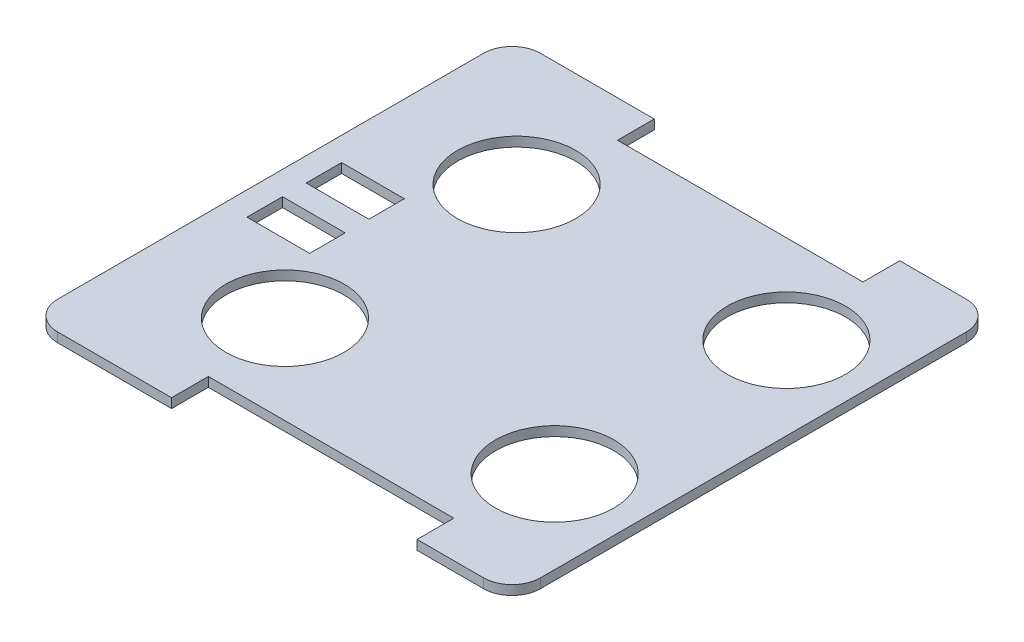
ISO-10303-21;
HEADER;
FILE_DESCRIPTION(('STEP AP214'),'2;1');
FILE_NAME('part.step','',(''),(''),'','','');
FILE_SCHEMA(('AUTOMOTIVE_DESIGN { 1 0 10303 214 1 1 1 1 }'));
ENDSEC;
DATA;
#1=APPLICATION_CONTEXT('core data for automotive mechanical design processes');
#2=APPLICATION_PROTOCOL_DEFINITION('international standard','automotive_design',2000,#1);
#3=PRODUCT_CONTEXT('',#1,'mechanical');
#4=PRODUCT('Part','Part','',(#3));
#5=PRODUCT_RELATED_PRODUCT_CATEGORY('part','',(#4));
#6=PRODUCT_DEFINITION_FORMATION('','',#4);
#7=PRODUCT_DEFINITION_CONTEXT('part definition',#1,'design');
#8=PRODUCT_DEFINITION('design','',#6,#7);
#9=PRODUCT_DEFINITION_SHAPE('','',#8);
#10=(LENGTH_UNIT() NAMED_UNIT(*) SI_UNIT(.MILLI.,.METRE.));
#11=(NAMED_UNIT(*) PLANE_ANGLE_UNIT() SI_UNIT($,.RADIAN.));
#12=(NAMED_UNIT(*) SI_UNIT($,.STERADIAN.) SOLID_ANGLE_UNIT());
#13=UNCERTAINTY_MEASURE_WITH_UNIT(LENGTH_MEASURE(1.E-05),#10,'distance_accuracy_value','');
#14=(GEOMETRIC_REPRESENTATION_CONTEXT(3) GLOBAL_UNCERTAINTY_ASSIGNED_CONTEXT((#13)) GLOBAL_UNIT_ASSIGNED_CONTEXT((#10,
#11,#12)) REPRESENTATION_CONTEXT('',''));
#15=CARTESIAN_POINT('',(0.,0.,0.));
#16=DIRECTION('',(0.,0.,1.));
#17=DIRECTION('',(1.,0.,0.));
#18=AXIS2_PLACEMENT_3D('',#15,#16,#17);
#19=CARTESIAN_POINT('',(-135.857036721238,58.7071385573017,92.1));
#20=DIRECTION('',(-1.,0.,0.));
#21=DIRECTION('',(0.,0.,1.));
#22=AXIS2_PLACEMENT_3D('',#19,#20,#21);
#23=PLANE('',#22);
#24=DIRECTION('',(0.,0.,-1.));
#25=VECTOR('',#24,1.);
#26=CARTESIAN_POINT('',(-135.857036721238,50.7071385573017,92.1));
#27=LINE('',#26,#25);
#28=CARTESIAN_POINT('',(-135.857036721238,50.7071385573017,92.1));
#29=VERTEX_POINT('',#28);
#30=CARTESIAN_POINT('',(-135.857036721238,50.7071385573017,61.0044654302729));
#31=VERTEX_POINT('',#30);
#32=EDGE_CURVE('E280',#29,#31,#27,.T.);
#33=ORIENTED_EDGE('',*,*,#32,.T.);
#34=DIRECTION('',(0.,-1.,0.));
#35=VECTOR('',#34,1.);
#36=CARTESIAN_POINT('',(-135.857036721238,58.7071385573017,61.0044654302729));
#37=LINE('',#36,#35);
#38=CARTESIAN_POINT('',(-135.857036721238,58.7071385573017,61.0044654302729));
#39=VERTEX_POINT('',#38);
#40=EDGE_CURVE('E11',#39,#31,#37,.T.);
#41=ORIENTED_EDGE('',*,*,#40,.F.);
#42=DIRECTION('',(0.,0.,-1.));
#43=VECTOR('',#42,1.);
#44=CARTESIAN_POINT('',(-135.857036721238,58.7071385573017,92.1));
#45=LINE('',#44,#43);
#46=CARTESIAN_POINT('',(-135.857036721238,58.7071385573017,92.1));
#47=VERTEX_POINT('',#46);
#48=EDGE_CURVE('E281',#47,#39,#45,.T.);
#49=ORIENTED_EDGE('',*,*,#48,.F.);
#50=DIRECTION('',(0.,-1.,0.));
#51=VECTOR('',#50,1.);
#52=CARTESIAN_POINT('',(-135.857036721238,58.7071385573017,92.1));
#53=LINE('',#52,#51);
#54=EDGE_CURVE('E315',#47,#29,#53,.T.);
#55=ORIENTED_EDGE('',*,*,#54,.T.);
#56=EDGE_LOOP('',(#33,#41,#49,#55));
#57=FACE_BOUND('',#56,.T.);
#58=ADVANCED_FACE('F41',(#57),#23,.F.);
#59=CARTESIAN_POINT('',(-232.102036721238,58.7071385573017,61.0044654302729));
#60=DIRECTION('',(0.,0.,1.));
#61=DIRECTION('',(1.,0.,0.));
#62=AXIS2_PLACEMENT_3D('',#59,#60,#61);
#63=PLANE('',#62);
#64=DIRECTION('',(-1.,0.,0.));
#65=VECTOR('',#64,1.);
#66=CARTESIAN_POINT('',(-232.102036721238,50.7071385573017,61.0044654302729));
#67=LINE('',#66,#65);
#68=CARTESIAN_POINT('',(-232.102036721238,50.7071385573017,61.0044654302729));
#69=VERTEX_POINT('',#68);
#70=EDGE_CURVE('E318',#31,#69,#67,.T.);
#71=ORIENTED_EDGE('',*,*,#70,.T.);
#72=DIRECTION('',(0.,-1.,0.));
#73=VECTOR('',#72,1.);
#74=CARTESIAN_POINT('',(-232.102036721238,58.7071385573017,61.0044654302729));
#75=LINE('',#74,#73);
#76=CARTESIAN_POINT('',(-232.102036721238,58.7071385573017,61.0044654302729));
#77=VERTEX_POINT('',#76);
#78=EDGE_CURVE('E48',#77,#69,#75,.T.);
#79=ORIENTED_EDGE('',*,*,#78,.F.);
#80=DIRECTION('',(-1.,0.,0.));
#81=VECTOR('',#80,1.);
#82=CARTESIAN_POINT('',(-232.102036721238,58.7071385573017,61.0044654302729));
#83=LINE('',#82,#81);
#84=EDGE_CURVE('E284',#39,#77,#83,.T.);
#85=ORIENTED_EDGE('',*,*,#84,.F.);
#86=ORIENTED_EDGE('',*,*,#40,.T.);
#87=EDGE_LOOP('',(#71,#79,#85,#86));
#88=FACE_BOUND('',#87,.T.);
#89=ADVANCED_FACE('F414',(#88),#63,.F.);
#90=CARTESIAN_POINT('',(-232.102036721238,58.7071385573017,85.));
#91=DIRECTION('',(0.,-1.,0.));
#92=DIRECTION('',(0.,0.,-1.));
#93=AXIS2_PLACEMENT_3D('',#90,#91,#92);
#94=CYLINDRICAL_SURFACE('',#93,23.9955345697271);
#95=CARTESIAN_POINT('',(-232.102036721238,50.7071385573017,85.));
#96=DIRECTION('',(0.,1.,0.));
#97=DIRECTION('',(0.,0.,1.));
#98=AXIS2_PLACEMENT_3D('',#95,#96,#97);
#99=CIRCLE('',#98,23.9955345697271);
#100=CARTESIAN_POINT('',(-256.097571290965,50.7071385573017,85.));
#101=VERTEX_POINT('',#100);
#102=EDGE_CURVE('E320',#69,#101,#99,.T.);
#103=ORIENTED_EDGE('',*,*,#102,.T.);
#104=DIRECTION('',(0.,-1.,0.));
#105=VECTOR('',#104,1.);
#106=CARTESIAN_POINT('',(-256.097571290965,58.7071385573017,85.));
#107=LINE('',#106,#105);
#108=CARTESIAN_POINT('',(-256.097571290965,58.7071385573017,85.));
#109=VERTEX_POINT('',#108);
#110=EDGE_CURVE('E385',#109,#101,#107,.T.);
#111=ORIENTED_EDGE('',*,*,#110,.F.);
#112=CARTESIAN_POINT('',(-232.102036721238,58.7071385573017,85.));
#113=DIRECTION('',(0.,1.,0.));
#114=DIRECTION('',(0.,0.,1.));
#115=AXIS2_PLACEMENT_3D('',#112,#113,#114);
#116=CIRCLE('',#115,23.9955345697271);
#117=EDGE_CURVE('E287',#77,#109,#116,.T.);
#118=ORIENTED_EDGE('',*,*,#117,.F.);
#119=ORIENTED_EDGE('',*,*,#78,.T.);
#120=EDGE_LOOP('',(#103,#111,#118,#119));
#121=FACE_BOUND('',#120,.T.);
#122=ADVANCED_FACE('F392',(#121),#94,.T.);
#123=CARTESIAN_POINT('',(-256.097571290965,58.7071385573017,445.));
#124=DIRECTION('',(1.,0.,0.));
#125=DIRECTION('',(0.,0.,-1.));
#126=AXIS2_PLACEMENT_3D('',#123,#124,#125);
#127=PLANE('',#126);
#128=DIRECTION('',(0.,0.,1.));
#129=VECTOR('',#128,1.);
#130=CARTESIAN_POINT('',(-256.097571290965,50.7071385573017,445.));
#131=LINE('',#130,#129);
#132=CARTESIAN_POINT('',(-256.097571290965,50.7071385573017,445.));
#133=VERTEX_POINT('',#132);
#134=EDGE_CURVE('E322',#101,#133,#131,.T.);
#135=ORIENTED_EDGE('',*,*,#134,.T.);
#136=DIRECTION('',(0.,-1.,0.));
#137=VECTOR('',#136,1.);
#138=CARTESIAN_POINT('',(-256.097571290965,58.7071385573017,445.));
#139=LINE('',#138,#137);
#140=CARTESIAN_POINT('',(-256.097571290965,58.7071385573017,445.));
#141=VERTEX_POINT('',#140);
#142=EDGE_CURVE('E382',#141,#133,#139,.T.);
#143=ORIENTED_EDGE('',*,*,#142,.F.);
#144=DIRECTION('',(0.,0.,1.));
#145=VECTOR('',#144,1.);
#146=CARTESIAN_POINT('',(-256.097571290965,58.7071385573017,445.));
#147=LINE('',#146,#145);
#148=EDGE_CURVE('E289',#109,#141,#147,.T.);
#149=ORIENTED_EDGE('',*,*,#148,.F.);
#150=ORIENTED_EDGE('',*,*,#110,.T.);
#151=EDGE_LOOP('',(#135,#143,#149,#150));
#152=FACE_BOUND('',#151,.T.);
#153=ADVANCED_FACE('F402',(#152),#127,.F.);
#154=CARTESIAN_POINT('',(-232.102036721238,58.7071385573017,445.));
#155=DIRECTION('',(0.,-1.,0.));
#156=DIRECTION('',(0.,0.,-1.));
#157=AXIS2_PLACEMENT_3D('',#154,#155,#156);
#158=CYLINDRICAL_SURFACE('',#157,23.9955345697271);
#159=CARTESIAN_POINT('',(-232.102036721238,50.7071385573017,445.));
#160=DIRECTION('',(0.,1.,0.));
#161=DIRECTION('',(0.,0.,1.));
#162=AXIS2_PLACEMENT_3D('',#159,#160,#161);
#163=CIRCLE('',#162,23.9955345697271);
#164=CARTESIAN_POINT('',(-232.102036721238,50.7071385573017,468.995534569727));
#165=VERTEX_POINT('',#164);
#166=EDGE_CURVE('E324',#133,#165,#163,.T.);
#167=ORIENTED_EDGE('',*,*,#166,.T.);
#168=DIRECTION('',(0.,-1.,0.));
#169=VECTOR('',#168,1.);
#170=CARTESIAN_POINT('',(-232.102036721238,58.7071385573017,468.995534569727));
#171=LINE('',#170,#169);
#172=CARTESIAN_POINT('',(-232.102036721238,58.7071385573017,468.995534569727));
#173=VERTEX_POINT('',#172);
#174=EDGE_CURVE('E379',#173,#165,#171,.T.);
#175=ORIENTED_EDGE('',*,*,#174,.F.);
#176=CARTESIAN_POINT('',(-232.102036721238,58.7071385573017,445.));
#177=DIRECTION('',(0.,1.,0.));
#178=DIRECTION('',(0.,0.,1.));
#179=AXIS2_PLACEMENT_3D('',#176,#177,#178);
#180=CIRCLE('',#179,23.9955345697271);
#181=EDGE_CURVE('E291',#141,#173,#180,.T.);
#182=ORIENTED_EDGE('',*,*,#181,.F.);
#183=ORIENTED_EDGE('',*,*,#142,.T.);
#184=EDGE_LOOP('',(#167,#175,#182,#183));
#185=FACE_BOUND('',#184,.T.);
#186=ADVANCED_FACE('F406',(#185),#158,.T.);
#187=CARTESIAN_POINT('',(-135.857036721238,58.7071385573017,468.995534569727));
#188=DIRECTION('',(0.,0.,-1.));
#189=DIRECTION('',(-1.,0.,0.));
#190=AXIS2_PLACEMENT_3D('',#187,#188,#189);
#191=PLANE('',#190);
#192=DIRECTION('',(1.,0.,0.));
#193=VECTOR('',#192,1.);
#194=CARTESIAN_POINT('',(-135.857036721238,50.7071385573017,468.995534569727));
#195=LINE('',#194,#193);
#196=CARTESIAN_POINT('',(-135.857036721238,50.7071385573017,468.995534569727));
#197=VERTEX_POINT('',#196);
#198=EDGE_CURVE('E326',#165,#197,#195,.T.);
#199=ORIENTED_EDGE('',*,*,#198,.T.);
#200=DIRECTION('',(0.,-1.,0.));
#201=VECTOR('',#200,1.);
#202=CARTESIAN_POINT('',(-135.857036721238,58.7071385573017,468.995534569727));
#203=LINE('',#202,#201);
#204=CARTESIAN_POINT('',(-135.857036721238,58.7071385573017,468.995534569727));
#205=VERTEX_POINT('',#204);
#206=EDGE_CURVE('E376',#205,#197,#203,.T.);
#207=ORIENTED_EDGE('',*,*,#206,.F.);
#208=DIRECTION('',(1.,0.,0.));
#209=VECTOR('',#208,1.);
#210=CARTESIAN_POINT('',(-135.857036721238,58.7071385573017,468.995534569727));
#211=LINE('',#210,#209);
#212=EDGE_CURVE('E293',#173,#205,#211,.T.);
#213=ORIENTED_EDGE('',*,*,#212,.F.);
#214=ORIENTED_EDGE('',*,*,#174,.T.);
#215=EDGE_LOOP('',(#199,#207,#213,#214));
#216=FACE_BOUND('',#215,.T.);
#217=ADVANCED_FACE('F467',(#216),#191,.F.);
#218=CARTESIAN_POINT('',(-135.857036721238,58.7071385573017,437.9));
#219=DIRECTION('',(-1.,0.,0.));
#220=DIRECTION('',(0.,0.,1.));
#221=AXIS2_PLACEMENT_3D('',#218,#219,#220);
#222=PLANE('',#221);
#223=DIRECTION('',(0.,0.,-1.));
#224=VECTOR('',#223,1.);
#225=CARTESIAN_POINT('',(-135.857036721238,50.7071385573017,437.9));
#226=LINE('',#225,#224);
#227=CARTESIAN_POINT('',(-135.857036721238,50.7071385573017,437.9));
#228=VERTEX_POINT('',#227);
#229=EDGE_CURVE('E328',#197,#228,#226,.T.);
#230=ORIENTED_EDGE('',*,*,#229,.T.);
#231=DIRECTION('',(0.,-1.,0.));
#232=VECTOR('',#231,1.);
#233=CARTESIAN_POINT('',(-135.857036721238,58.7071385573017,437.9));
#234=LINE('',#233,#232);
#235=CARTESIAN_POINT('',(-135.857036721238,58.7071385573017,437.9));
#236=VERTEX_POINT('',#235);
#237=EDGE_CURVE('E373',#236,#228,#234,.T.);
#238=ORIENTED_EDGE('',*,*,#237,.F.);
#239=DIRECTION('',(0.,0.,-1.));
#240=VECTOR('',#239,1.);
#241=CARTESIAN_POINT('',(-135.857036721238,58.7071385573017,437.9));
#242=LINE('',#241,#240);
#243=EDGE_CURVE('E295',#205,#236,#242,.T.);
#244=ORIENTED_EDGE('',*,*,#243,.F.);
#245=ORIENTED_EDGE('',*,*,#206,.T.);
#246=EDGE_LOOP('',(#230,#238,#244,#245));
#247=FACE_BOUND('',#246,.T.);
#248=ADVANCED_FACE('F464',(#247),#222,.F.);
#249=CARTESIAN_POINT('',(-135.857036721238,58.7071385573017,437.9));
#250=DIRECTION('',(0.,0.,-1.));
#251=DIRECTION('',(-1.,0.,0.));
#252=AXIS2_PLACEMENT_3D('',#249,#250,#251);
#253=PLANE('',#252);
#254=DIRECTION('',(1.,0.,0.));
#255=VECTOR('',#254,1.);
#256=CARTESIAN_POINT('',(-135.857036721238,50.7071385573017,437.9));
#257=LINE('',#256,#255);
#258=CARTESIAN_POINT('',(71.6529632787621,50.7071385573017,437.9));
#259=VERTEX_POINT('',#258);
#260=EDGE_CURVE('E330',#228,#259,#257,.T.);
#261=ORIENTED_EDGE('',*,*,#260,.T.);
#262=DIRECTION('',(0.,-1.,0.));
#263=VECTOR('',#262,1.);
#264=CARTESIAN_POINT('',(71.6529632787621,58.7071385573017,437.9));
#265=LINE('',#264,#263);
#266=CARTESIAN_POINT('',(71.6529632787621,58.7071385573017,437.9));
#267=VERTEX_POINT('',#266);
#268=EDGE_CURVE('E370',#267,#259,#265,.T.);
#269=ORIENTED_EDGE('',*,*,#268,.F.);
#270=DIRECTION('',(1.,0.,0.));
#271=VECTOR('',#270,1.);
#272=CARTESIAN_POINT('',(-135.857036721238,58.7071385573017,437.9));
#273=LINE('',#272,#271);
#274=EDGE_CURVE('E297',#236,#267,#273,.T.);
#275=ORIENTED_EDGE('',*,*,#274,.F.);
#276=ORIENTED_EDGE('',*,*,#237,.T.);
#277=EDGE_LOOP('',(#261,#269,#275,#276));
#278=FACE_BOUND('',#277,.T.);
#279=ADVANCED_FACE('F460',(#278),#253,.F.);
#280=CARTESIAN_POINT('',(71.6529632787621,58.7071385573017,437.9));
#281=DIRECTION('',(1.,0.,0.));
#282=DIRECTION('',(0.,0.,-1.));
#283=AXIS2_PLACEMENT_3D('',#280,#281,#282);
#284=PLANE('',#283);
#285=DIRECTION('',(0.,0.,1.));
#286=VECTOR('',#285,1.);
#287=CARTESIAN_POINT('',(71.6529632787621,50.7071385573017,437.9));
#288=LINE('',#287,#286);
#289=CARTESIAN_POINT('',(71.6529632787621,50.7071385573017,468.995534569727));
#290=VERTEX_POINT('',#289);
#291=EDGE_CURVE('E332',#259,#290,#288,.T.);
#292=ORIENTED_EDGE('',*,*,#291,.T.);
#293=DIRECTION('',(0.,-1.,0.));
#294=VECTOR('',#293,1.);
#295=CARTESIAN_POINT('',(71.6529632787621,58.7071385573017,468.995534569727));
#296=LINE('',#295,#294);
#297=CARTESIAN_POINT('',(71.6529632787621,58.7071385573017,468.995534569727));
#298=VERTEX_POINT('',#297);
#299=EDGE_CURVE('E367',#298,#290,#296,.T.);
#300=ORIENTED_EDGE('',*,*,#299,.F.);
#301=DIRECTION('',(0.,0.,1.));
#302=VECTOR('',#301,1.);
#303=CARTESIAN_POINT('',(71.6529632787621,58.7071385573017,437.9));
#304=LINE('',#303,#302);
#305=EDGE_CURVE('E299',#267,#298,#304,.T.);
#306=ORIENTED_EDGE('',*,*,#305,.F.);
#307=ORIENTED_EDGE('',*,*,#268,.T.);
#308=EDGE_LOOP('',(#292,#300,#306,#307));
#309=FACE_BOUND('',#308,.T.);
#310=ADVANCED_FACE('F456',(#309),#284,.F.);
#311=CARTESIAN_POINT('',(127.897963278762,58.7071385573017,468.995534569727));
#312=DIRECTION('',(0.,0.,-1.));
#313=DIRECTION('',(-1.,0.,0.));
#314=AXIS2_PLACEMENT_3D('',#311,#312,#313);
#315=PLANE('',#314);
#316=DIRECTION('',(1.,0.,0.));
#317=VECTOR('',#316,1.);
#318=CARTESIAN_POINT('',(127.897963278762,50.7071385573017,468.995534569727));
#319=LINE('',#318,#317);
#320=CARTESIAN_POINT('',(127.897963278762,50.7071385573017,468.995534569727));
#321=VERTEX_POINT('',#320);
#322=EDGE_CURVE('E334',#290,#321,#319,.T.);
#323=ORIENTED_EDGE('',*,*,#322,.T.);
#324=DIRECTION('',(0.,-1.,0.));
#325=VECTOR('',#324,1.);
#326=CARTESIAN_POINT('',(127.897963278762,58.7071385573017,468.995534569727));
#327=LINE('',#326,#325);
#328=CARTESIAN_POINT('',(127.897963278762,58.7071385573017,468.995534569727));
#329=VERTEX_POINT('',#328);
#330=EDGE_CURVE('E364',#329,#321,#327,.T.);
#331=ORIENTED_EDGE('',*,*,#330,.F.);
#332=DIRECTION('',(1.,0.,0.));
#333=VECTOR('',#332,1.);
#334=CARTESIAN_POINT('',(127.897963278762,58.7071385573017,468.995534569727));
#335=LINE('',#334,#333);
#336=EDGE_CURVE('E301',#298,#329,#335,.T.);
#337=ORIENTED_EDGE('',*,*,#336,.F.);
#338=ORIENTED_EDGE('',*,*,#299,.T.);
#339=EDGE_LOOP('',(#323,#331,#337,#338));
#340=FACE_BOUND('',#339,.T.);
#341=ADVANCED_FACE('F451',(#340),#315,.F.);
#342=CARTESIAN_POINT('',(127.897963278762,58.7071385573017,445.));
#343=DIRECTION('',(0.,-1.,0.));
#344=DIRECTION('',(0.,0.,-1.));
#345=AXIS2_PLACEMENT_3D('',#342,#343,#344);
#346=CYLINDRICAL_SURFACE('',#345,23.9955345697271);
#347=CARTESIAN_POINT('',(127.897963278762,50.7071385573017,445.));
#348=DIRECTION('',(0.,1.,0.));
#349=DIRECTION('',(0.,0.,1.));
#350=AXIS2_PLACEMENT_3D('',#347,#348,#349);
#351=CIRCLE('',#350,23.9955345697271);
#352=CARTESIAN_POINT('',(151.893497848489,50.7071385573017,445.));
#353=VERTEX_POINT('',#352);
#354=EDGE_CURVE('E336',#321,#353,#351,.T.);
#355=ORIENTED_EDGE('',*,*,#354,.T.);
#356=DIRECTION('',(0.,-1.,0.));
#357=VECTOR('',#356,1.);
#358=CARTESIAN_POINT('',(151.893497848489,58.7071385573017,445.));
#359=LINE('',#358,#357);
#360=CARTESIAN_POINT('',(151.893497848489,58.7071385573017,445.));
#361=VERTEX_POINT('',#360);
#362=EDGE_CURVE('E361',#361,#353,#359,.T.);
#363=ORIENTED_EDGE('',*,*,#362,.F.);
#364=CARTESIAN_POINT('',(127.897963278762,58.7071385573017,445.));
#365=DIRECTION('',(0.,1.,0.));
#366=DIRECTION('',(0.,0.,1.));
#367=AXIS2_PLACEMENT_3D('',#364,#365,#366);
#368=CIRCLE('',#367,23.9955345697271);
#369=EDGE_CURVE('E303',#329,#361,#368,.T.);
#370=ORIENTED_EDGE('',*,*,#369,.F.);
#371=ORIENTED_EDGE('',*,*,#330,.T.);
#372=EDGE_LOOP('',(#355,#363,#370,#371));
#373=FACE_BOUND('',#372,.T.);
#374=ADVANCED_FACE('F445',(#373),#346,.T.);
#375=CARTESIAN_POINT('',(151.893497848489,58.7071385573017,85.0000000000001));
#376=DIRECTION('',(-1.,0.,0.));
#377=DIRECTION('',(0.,0.,1.));
#378=AXIS2_PLACEMENT_3D('',#375,#376,#377);
#379=PLANE('',#378);
#380=DIRECTION('',(0.,0.,-1.));
#381=VECTOR('',#380,1.);
#382=CARTESIAN_POINT('',(151.893497848489,50.7071385573017,85.0000000000001));
#383=LINE('',#382,#381);
#384=CARTESIAN_POINT('',(151.893497848489,50.7071385573017,85.0000000000001));
#385=VERTEX_POINT('',#384);
#386=EDGE_CURVE('E338',#353,#385,#383,.T.);
#387=ORIENTED_EDGE('',*,*,#386,.T.);
#388=DIRECTION('',(0.,-1.,0.));
#389=VECTOR('',#388,1.);
#390=CARTESIAN_POINT('',(151.893497848489,58.7071385573017,85.0000000000001));
#391=LINE('',#390,#389);
#392=CARTESIAN_POINT('',(151.893497848489,58.7071385573017,85.0000000000001));
#393=VERTEX_POINT('',#392);
#394=EDGE_CURVE('E358',#393,#385,#391,.T.);
#395=ORIENTED_EDGE('',*,*,#394,.F.);
#396=DIRECTION('',(0.,0.,-1.));
#397=VECTOR('',#396,1.);
#398=CARTESIAN_POINT('',(151.893497848489,58.7071385573017,85.0000000000001));
#399=LINE('',#398,#397);
#400=EDGE_CURVE('E305',#361,#393,#399,.T.);
#401=ORIENTED_EDGE('',*,*,#400,.F.);
#402=ORIENTED_EDGE('',*,*,#362,.T.);
#403=EDGE_LOOP('',(#387,#395,#401,#402));
#404=FACE_BOUND('',#403,.T.);
#405=ADVANCED_FACE('F441',(#404),#379,.F.);
#406=CARTESIAN_POINT('',(127.897963278762,58.7071385573017,85.));
#407=DIRECTION('',(0.,-1.,0.));
#408=DIRECTION('',(0.,0.,-1.));
#409=AXIS2_PLACEMENT_3D('',#406,#407,#408);
#410=CYLINDRICAL_SURFACE('',#409,23.9955345697272);
#411=CARTESIAN_POINT('',(127.897963278762,50.7071385573017,85.));
#412=DIRECTION('',(0.,1.,0.));
#413=DIRECTION('',(0.,0.,1.));
#414=AXIS2_PLACEMENT_3D('',#411,#412,#413);
#415=CIRCLE('',#414,23.9955345697272);
#416=CARTESIAN_POINT('',(127.897963278762,50.7071385573017,61.0044654302729));
#417=VERTEX_POINT('',#416);
#418=EDGE_CURVE('E340',#385,#417,#415,.T.);
#419=ORIENTED_EDGE('',*,*,#418,.T.);
#420=DIRECTION('',(0.,-1.,0.));
#421=VECTOR('',#420,1.);
#422=CARTESIAN_POINT('',(127.897963278762,58.7071385573017,61.0044654302729));
#423=LINE('',#422,#421);
#424=CARTESIAN_POINT('',(127.897963278762,58.7071385573017,61.0044654302729));
#425=VERTEX_POINT('',#424);
#426=EDGE_CURVE('E355',#425,#417,#423,.T.);
#427=ORIENTED_EDGE('',*,*,#426,.F.);
#428=CARTESIAN_POINT('',(127.897963278762,58.7071385573017,85.));
#429=DIRECTION('',(0.,1.,0.));
#430=DIRECTION('',(0.,0.,1.));
#431=AXIS2_PLACEMENT_3D('',#428,#429,#430);
#432=CIRCLE('',#431,23.9955345697272);
#433=EDGE_CURVE('E307',#393,#425,#432,.T.);
#434=ORIENTED_EDGE('',*,*,#433,.F.);
#435=ORIENTED_EDGE('',*,*,#394,.T.);
#436=EDGE_LOOP('',(#419,#427,#434,#435));
#437=FACE_BOUND('',#436,.T.);
#438=ADVANCED_FACE('F436',(#437),#410,.T.);
#439=CARTESIAN_POINT('',(71.6529632787621,58.7071385573017,61.0044654302728));
#440=DIRECTION('',(0.,0.,1.));
#441=DIRECTION('',(1.,0.,0.));
#442=AXIS2_PLACEMENT_3D('',#439,#440,#441);
#443=PLANE('',#442);
#444=DIRECTION('',(-1.,0.,0.));
#445=VECTOR('',#444,1.);
#446=CARTESIAN_POINT('',(71.6529632787621,50.7071385573017,61.0044654302728));
#447=LINE('',#446,#445);
#448=CARTESIAN_POINT('',(71.6529632787621,50.7071385573017,61.0044654302728));
#449=VERTEX_POINT('',#448);
#450=EDGE_CURVE('E342',#417,#449,#447,.T.);
#451=ORIENTED_EDGE('',*,*,#450,.T.);
#452=DIRECTION('',(0.,-1.,0.));
#453=VECTOR('',#452,1.);
#454=CARTESIAN_POINT('',(71.6529632787621,58.7071385573017,61.0044654302728));
#455=LINE('',#454,#453);
#456=CARTESIAN_POINT('',(71.6529632787621,58.7071385573017,61.0044654302728));
#457=VERTEX_POINT('',#456);
#458=EDGE_CURVE('E352',#457,#449,#455,.T.);
#459=ORIENTED_EDGE('',*,*,#458,.F.);
#460=DIRECTION('',(-1.,0.,0.));
#461=VECTOR('',#460,1.);
#462=CARTESIAN_POINT('',(71.6529632787621,58.7071385573017,61.0044654302728));
#463=LINE('',#462,#461);
#464=EDGE_CURVE('E309',#425,#457,#463,.T.);
#465=ORIENTED_EDGE('',*,*,#464,.F.);
#466=ORIENTED_EDGE('',*,*,#426,.T.);
#467=EDGE_LOOP('',(#451,#459,#465,#466));
#468=FACE_BOUND('',#467,.T.);
#469=ADVANCED_FACE('F430',(#468),#443,.F.);
#470=CARTESIAN_POINT('',(71.6529632787621,58.7071385573017,92.1));
#471=DIRECTION('',(1.,0.,0.));
#472=DIRECTION('',(0.,0.,-1.));
#473=AXIS2_PLACEMENT_3D('',#470,#471,#472);
#474=PLANE('',#473);
#475=DIRECTION('',(0.,0.,1.));
#476=VECTOR('',#475,1.);
#477=CARTESIAN_POINT('',(71.6529632787621,50.7071385573017,92.1));
#478=LINE('',#477,#476);
#479=CARTESIAN_POINT('',(71.6529632787621,50.7071385573017,92.1));
#480=VERTEX_POINT('',#479);
#481=EDGE_CURVE('E344',#449,#480,#478,.T.);
#482=ORIENTED_EDGE('',*,*,#481,.T.);
#483=DIRECTION('',(0.,-1.,0.));
#484=VECTOR('',#483,1.);
#485=CARTESIAN_POINT('',(71.6529632787621,58.7071385573017,92.1));
#486=LINE('',#485,#484);
#487=CARTESIAN_POINT('',(71.6529632787621,58.7071385573017,92.1));
#488=VERTEX_POINT('',#487);
#489=EDGE_CURVE('E349',#488,#480,#486,.T.);
#490=ORIENTED_EDGE('',*,*,#489,.F.);
#491=DIRECTION('',(0.,0.,1.));
#492=VECTOR('',#491,1.);
#493=CARTESIAN_POINT('',(71.6529632787621,58.7071385573017,92.1));
#494=LINE('',#493,#492);
#495=EDGE_CURVE('E311',#457,#488,#494,.T.);
#496=ORIENTED_EDGE('',*,*,#495,.F.);
#497=ORIENTED_EDGE('',*,*,#458,.T.);
#498=EDGE_LOOP('',(#482,#490,#496,#497));
#499=FACE_BOUND('',#498,.T.);
#500=ADVANCED_FACE('F426',(#499),#474,.F.);
#501=CARTESIAN_POINT('',(-135.857036721238,58.7071385573017,92.1));
#502=DIRECTION('',(0.,0.,1.));
#503=DIRECTION('',(1.,0.,0.));
#504=AXIS2_PLACEMENT_3D('',#501,#502,#503);
#505=PLANE('',#504);
#506=DIRECTION('',(-1.,0.,0.));
#507=VECTOR('',#506,1.);
#508=CARTESIAN_POINT('',(-135.857036721238,50.7071385573017,92.1));
#509=LINE('',#508,#507);
#510=EDGE_CURVE('E285',#480,#29,#509,.T.);
#511=ORIENTED_EDGE('',*,*,#510,.T.);
#512=ORIENTED_EDGE('',*,*,#54,.F.);
#513=DIRECTION('',(-1.,0.,0.));
#514=VECTOR('',#513,1.);
#515=CARTESIAN_POINT('',(-135.857036721238,58.7071385573017,92.1));
#516=LINE('',#515,#514);
#517=EDGE_CURVE('E313',#488,#47,#516,.T.);
#518=ORIENTED_EDGE('',*,*,#517,.F.);
#519=ORIENTED_EDGE('',*,*,#489,.T.);
#520=EDGE_LOOP('',(#511,#512,#518,#519));
#521=FACE_BOUND('',#520,.T.);
#522=ADVANCED_FACE('F421',(#521),#505,.F.);
#523=CARTESIAN_POINT('',(-232.102036721238,58.7071385573017,85.));
#524=DIRECTION('',(0.,1.,0.));
#525=DIRECTION('',(0.,0.,1.));
#526=AXIS2_PLACEMENT_3D('',#523,#524,#525);
#527=PLANE('',#526);
#528=CARTESIAN_POINT('',(-146.097571290965,58.7071385573017,362.9));
#529=DIRECTION('',(0.,1.,0.));
#530=DIRECTION('',(0.,0.,1.));
#531=AXIS2_PLACEMENT_3D('',#528,#529,#530);
#532=CIRCLE('',#531,49.9999999999998);
#533=CARTESIAN_POINT('',(-146.097571290965,58.7071385573017,412.9));
#534=VERTEX_POINT('',#533);
#535=EDGE_CURVE('E232',#534,#534,#532,.T.);
#536=ORIENTED_EDGE('',*,*,#535,.F.);
#537=EDGE_LOOP('',(#536));
#538=FACE_BOUND('',#537,.T.);
#539=DIRECTION('',(0.,0.,1.));
#540=VECTOR('',#539,1.);
#541=CARTESIAN_POINT('',(-236.097571290965,58.7071385573017,275.));
#542=LINE('',#541,#540);
#543=CARTESIAN_POINT('',(-236.097571290965,58.7071385573017,275.));
#544=VERTEX_POINT('',#543);
#545=CARTESIAN_POINT('',(-236.097571290965,58.7071385573017,305.));
#546=VERTEX_POINT('',#545);
#547=EDGE_CURVE('E55',#544,#546,#542,.T.);
#548=ORIENTED_EDGE('',*,*,#547,.F.);
#549=DIRECTION('',(-1.,0.,0.));
#550=VECTOR('',#549,1.);
#551=CARTESIAN_POINT('',(-236.097571290965,58.7071385573017,275.));
#552=LINE('',#551,#550);
#553=CARTESIAN_POINT('',(-183.097571290965,58.7071385573017,275.));
#554=VERTEX_POINT('',#553);
#555=EDGE_CURVE('E235',#554,#544,#552,.T.);
#556=ORIENTED_EDGE('',*,*,#555,.F.);
#557=DIRECTION('',(0.,0.,-1.));
#558=VECTOR('',#557,1.);
#559=CARTESIAN_POINT('',(-183.097571290965,58.7071385573017,275.));
#560=LINE('',#559,#558);
#561=CARTESIAN_POINT('',(-183.097571290965,58.7071385573017,305.));
#562=VERTEX_POINT('',#561);
#563=EDGE_CURVE('E243',#562,#554,#560,.T.);
#564=ORIENTED_EDGE('',*,*,#563,.F.);
#565=DIRECTION('',(1.,0.,0.));
#566=VECTOR('',#565,1.);
#567=CARTESIAN_POINT('',(-236.097571290965,58.7071385573017,305.));
#568=LINE('',#567,#566);
#569=EDGE_CURVE('E246',#546,#562,#568,.T.);
#570=ORIENTED_EDGE('',*,*,#569,.F.);
#571=EDGE_LOOP('',(#548,#556,#564,#570));
#572=FACE_BOUND('',#571,.T.);
#573=CARTESIAN_POINT('',(81.8934978484892,58.7071385573017,362.9));
#574=DIRECTION('',(0.,1.,0.));
#575=DIRECTION('',(0.,0.,-1.));
#576=AXIS2_PLACEMENT_3D('',#573,#574,#575);
#577=CIRCLE('',#576,49.9999999999998);
#578=CARTESIAN_POINT('',(81.8934978484892,58.7071385573017,312.9));
#579=VERTEX_POINT('',#578);
#580=EDGE_CURVE('E267',#579,#579,#577,.T.);
#581=ORIENTED_EDGE('',*,*,#580,.F.);
#582=EDGE_LOOP('',(#581));
#583=FACE_BOUND('',#582,.T.);
#584=CARTESIAN_POINT('',(-146.097571290965,58.7071385573017,167.1));
#585=DIRECTION('',(0.,1.,0.));
#586=DIRECTION('',(0.,0.,-1.));
#587=AXIS2_PLACEMENT_3D('',#584,#585,#586);
#588=CIRCLE('',#587,49.9999999999999);
#589=CARTESIAN_POINT('',(-146.097571290965,58.7071385573017,117.1));
#590=VERTEX_POINT('',#589);
#591=EDGE_CURVE('E266',#590,#590,#588,.T.);
#592=ORIENTED_EDGE('',*,*,#591,.F.);
#593=EDGE_LOOP('',(#592));
#594=FACE_BOUND('',#593,.T.);
#595=DIRECTION('',(0.,0.,1.));
#596=VECTOR('',#595,1.);
#597=CARTESIAN_POINT('',(-236.097571290965,58.7071385573017,255.));
#598=LINE('',#597,#596);
#599=CARTESIAN_POINT('',(-236.097571290965,58.7071385573017,225.));
#600=VERTEX_POINT('',#599);
#601=CARTESIAN_POINT('',(-236.097571290965,58.7071385573017,255.));
#602=VERTEX_POINT('',#601);
#603=EDGE_CURVE('E63',#600,#602,#598,.T.);
#604=ORIENTED_EDGE('',*,*,#603,.F.);
#605=DIRECTION('',(-1.,0.,0.));
#606=VECTOR('',#605,1.);
#607=CARTESIAN_POINT('',(-236.097571290965,58.7071385573017,225.));
#608=LINE('',#607,#606);
#609=CARTESIAN_POINT('',(-183.097571290965,58.7071385573017,225.));
#610=VERTEX_POINT('',#609);
#611=EDGE_CURVE('E208',#610,#600,#608,.T.);
#612=ORIENTED_EDGE('',*,*,#611,.F.);
#613=DIRECTION('',(0.,0.,-1.));
#614=VECTOR('',#613,1.);
#615=CARTESIAN_POINT('',(-183.097571290965,58.7071385573017,255.));
#616=LINE('',#615,#614);
#617=CARTESIAN_POINT('',(-183.097571290965,58.7071385573017,255.));
#618=VERTEX_POINT('',#617);
#619=EDGE_CURVE('E746',#618,#610,#616,.T.);
#620=ORIENTED_EDGE('',*,*,#619,.F.);
#621=DIRECTION('',(1.,0.,0.));
#622=VECTOR('',#621,1.);
#623=CARTESIAN_POINT('',(-236.097571290965,58.7071385573017,255.));
#624=LINE('',#623,#622);
#625=EDGE_CURVE('E745',#602,#618,#624,.T.);
#626=ORIENTED_EDGE('',*,*,#625,.F.);
#627=EDGE_LOOP('',(#604,#612,#620,#626));
#628=FACE_BOUND('',#627,.T.);
#629=CARTESIAN_POINT('',(81.8934978484892,58.7071385573017,167.1));
#630=DIRECTION('',(0.,1.,0.));
#631=DIRECTION('',(0.,0.,1.));
#632=AXIS2_PLACEMENT_3D('',#629,#630,#631);
#633=CIRCLE('',#632,49.9999999999999);
#634=CARTESIAN_POINT('',(81.8934978484892,58.7071385573017,217.1));
#635=VERTEX_POINT('',#634);
#636=EDGE_CURVE('E270',#635,#635,#633,.T.);
#637=ORIENTED_EDGE('',*,*,#636,.F.);
#638=EDGE_LOOP('',(#637));
#639=FACE_BOUND('',#638,.T.);
#640=ORIENTED_EDGE('',*,*,#48,.T.);
#641=ORIENTED_EDGE('',*,*,#84,.T.);
#642=ORIENTED_EDGE('',*,*,#117,.T.);
#643=ORIENTED_EDGE('',*,*,#148,.T.);
#644=ORIENTED_EDGE('',*,*,#181,.T.);
#645=ORIENTED_EDGE('',*,*,#212,.T.);
#646=ORIENTED_EDGE('',*,*,#243,.T.);
#647=ORIENTED_EDGE('',*,*,#274,.T.);
#648=ORIENTED_EDGE('',*,*,#305,.T.);
#649=ORIENTED_EDGE('',*,*,#336,.T.);
#650=ORIENTED_EDGE('',*,*,#369,.T.);
#651=ORIENTED_EDGE('',*,*,#400,.T.);
#652=ORIENTED_EDGE('',*,*,#433,.T.);
#653=ORIENTED_EDGE('',*,*,#464,.T.);
#654=ORIENTED_EDGE('',*,*,#495,.T.);
#655=ORIENTED_EDGE('',*,*,#517,.T.);
#656=EDGE_LOOP('',(#640,#641,#642,#643,#644,#645,#646,#647,#648,#649,#650,#651,#652,#653,#654,#655));
#657=FACE_BOUND('',#656,.T.);
#658=ADVANCED_FACE('F410',(#538,#572,#583,#594,#628,#639,#657),#527,.T.);
#659=CARTESIAN_POINT('',(-232.102036721238,50.7071385573017,85.));
#660=DIRECTION('',(0.,1.,0.));
#661=DIRECTION('',(0.,0.,1.));
#662=AXIS2_PLACEMENT_3D('',#659,#660,#661);
#663=PLANE('',#662);
#664=CARTESIAN_POINT('',(-146.097571290965,50.7071385573017,362.9));
#665=DIRECTION('',(0.,1.,0.));
#666=DIRECTION('',(0.,0.,1.));
#667=AXIS2_PLACEMENT_3D('',#664,#665,#666);
#668=CIRCLE('',#667,49.9999999999998);
#669=CARTESIAN_POINT('',(-146.097571290965,50.7071385573017,412.9));
#670=VERTEX_POINT('',#669);
#671=EDGE_CURVE('E224',#670,#670,#668,.F.);
#672=ORIENTED_EDGE('',*,*,#671,.F.);
#673=EDGE_LOOP('',(#672));
#674=FACE_BOUND('',#673,.T.);
#675=DIRECTION('',(1.,0.,0.));
#676=VECTOR('',#675,1.);
#677=CARTESIAN_POINT('',(-236.097571290965,50.7071385573017,275.));
#678=LINE('',#677,#676);
#679=CARTESIAN_POINT('',(-236.097571290965,50.7071385573017,275.));
#680=VERTEX_POINT('',#679);
#681=CARTESIAN_POINT('',(-183.097571290965,50.7071385573017,275.));
#682=VERTEX_POINT('',#681);
#683=EDGE_CURVE('E253',#680,#682,#678,.T.);
#684=ORIENTED_EDGE('',*,*,#683,.F.);
#685=DIRECTION('',(0.,0.,-1.));
#686=VECTOR('',#685,1.);
#687=CARTESIAN_POINT('',(-236.097571290965,50.7071385573017,275.));
#688=LINE('',#687,#686);
#689=CARTESIAN_POINT('',(-236.097571290965,50.7071385573017,305.));
#690=VERTEX_POINT('',#689);
#691=EDGE_CURVE('E250',#690,#680,#688,.T.);
#692=ORIENTED_EDGE('',*,*,#691,.F.);
#693=DIRECTION('',(-1.,0.,0.));
#694=VECTOR('',#693,1.);
#695=CARTESIAN_POINT('',(-236.097571290965,50.7071385573017,305.));
#696=LINE('',#695,#694);
#697=CARTESIAN_POINT('',(-183.097571290965,50.7071385573017,305.));
#698=VERTEX_POINT('',#697);
#699=EDGE_CURVE('E228',#698,#690,#696,.T.);
#700=ORIENTED_EDGE('',*,*,#699,.F.);
#701=DIRECTION('',(0.,0.,1.));
#702=VECTOR('',#701,1.);
#703=CARTESIAN_POINT('',(-183.097571290965,50.7071385573017,275.));
#704=LINE('',#703,#702);
#705=EDGE_CURVE('E256',#682,#698,#704,.T.);
#706=ORIENTED_EDGE('',*,*,#705,.F.);
#707=EDGE_LOOP('',(#684,#692,#700,#706));
#708=FACE_BOUND('',#707,.T.);
#709=CARTESIAN_POINT('',(81.8934978484892,50.7071385573017,362.9));
#710=DIRECTION('',(0.,1.,0.));
#711=DIRECTION('',(0.,0.,1.));
#712=AXIS2_PLACEMENT_3D('',#709,#710,#711);
#713=CIRCLE('',#712,49.9999999999998);
#714=CARTESIAN_POINT('',(81.8934978484892,50.7071385573017,412.9));
#715=VERTEX_POINT('',#714);
#716=EDGE_CURVE('E258',#715,#715,#713,.F.);
#717=ORIENTED_EDGE('',*,*,#716,.F.);
#718=EDGE_LOOP('',(#717));
#719=FACE_BOUND('',#718,.T.);
#720=CARTESIAN_POINT('',(-146.097571290965,50.7071385573017,167.1));
#721=DIRECTION('',(0.,1.,0.));
#722=DIRECTION('',(0.,0.,1.));
#723=AXIS2_PLACEMENT_3D('',#720,#721,#722);
#724=CIRCLE('',#723,49.9999999999999);
#725=CARTESIAN_POINT('',(-146.097571290965,50.7071385573017,217.1));
#726=VERTEX_POINT('',#725);
#727=EDGE_CURVE('E263',#726,#726,#724,.F.);
#728=ORIENTED_EDGE('',*,*,#727,.F.);
#729=EDGE_LOOP('',(#728));
#730=FACE_BOUND('',#729,.T.);
#731=DIRECTION('',(1.,0.,0.));
#732=VECTOR('',#731,1.);
#733=CARTESIAN_POINT('',(-236.097571290965,50.7071385573017,225.));
#734=LINE('',#733,#732);
#735=CARTESIAN_POINT('',(-236.097571290965,50.7071385573017,225.));
#736=VERTEX_POINT('',#735);
#737=CARTESIAN_POINT('',(-183.097571290965,50.7071385573017,225.));
#738=VERTEX_POINT('',#737);
#739=EDGE_CURVE('E205',#736,#738,#734,.T.);
#740=ORIENTED_EDGE('',*,*,#739,.F.);
#741=DIRECTION('',(0.,0.,-1.));
#742=VECTOR('',#741,1.);
#743=CARTESIAN_POINT('',(-236.097571290965,50.7071385573017,255.));
#744=LINE('',#743,#742);
#745=CARTESIAN_POINT('',(-236.097571290965,50.7071385573017,255.));
#746=VERTEX_POINT('',#745);
#747=EDGE_CURVE('E213',#746,#736,#744,.T.);
#748=ORIENTED_EDGE('',*,*,#747,.F.);
#749=DIRECTION('',(-1.,0.,0.));
#750=VECTOR('',#749,1.);
#751=CARTESIAN_POINT('',(-236.097571290965,50.7071385573017,255.));
#752=LINE('',#751,#750);
#753=CARTESIAN_POINT('',(-183.097571290965,50.7071385573017,255.));
#754=VERTEX_POINT('',#753);
#755=EDGE_CURVE('E210',#754,#746,#752,.T.);
#756=ORIENTED_EDGE('',*,*,#755,.F.);
#757=DIRECTION('',(0.,0.,1.));
#758=VECTOR('',#757,1.);
#759=CARTESIAN_POINT('',(-183.097571290965,50.7071385573017,255.));
#760=LINE('',#759,#758);
#761=EDGE_CURVE('E222',#738,#754,#760,.T.);
#762=ORIENTED_EDGE('',*,*,#761,.F.);
#763=EDGE_LOOP('',(#740,#748,#756,#762));
#764=FACE_BOUND('',#763,.T.);
#765=CARTESIAN_POINT('',(81.8934978484892,50.7071385573017,167.1));
#766=DIRECTION('',(0.,1.,0.));
#767=DIRECTION('',(0.,0.,1.));
#768=AXIS2_PLACEMENT_3D('',#765,#766,#767);
#769=CIRCLE('',#768,49.9999999999999);
#770=CARTESIAN_POINT('',(81.8934978484892,50.7071385573017,217.1));
#771=VERTEX_POINT('',#770);
#772=EDGE_CURVE('E277',#771,#771,#769,.F.);
#773=ORIENTED_EDGE('',*,*,#772,.F.);
#774=EDGE_LOOP('',(#773));
#775=FACE_BOUND('',#774,.T.);
#776=ORIENTED_EDGE('',*,*,#32,.F.);
#777=ORIENTED_EDGE('',*,*,#510,.F.);
#778=ORIENTED_EDGE('',*,*,#481,.F.);
#779=ORIENTED_EDGE('',*,*,#450,.F.);
#780=ORIENTED_EDGE('',*,*,#418,.F.);
#781=ORIENTED_EDGE('',*,*,#386,.F.);
#782=ORIENTED_EDGE('',*,*,#354,.F.);
#783=ORIENTED_EDGE('',*,*,#322,.F.);
#784=ORIENTED_EDGE('',*,*,#291,.F.);
#785=ORIENTED_EDGE('',*,*,#260,.F.);
#786=ORIENTED_EDGE('',*,*,#229,.F.);
#787=ORIENTED_EDGE('',*,*,#198,.F.);
#788=ORIENTED_EDGE('',*,*,#166,.F.);
#789=ORIENTED_EDGE('',*,*,#134,.F.);
#790=ORIENTED_EDGE('',*,*,#102,.F.);
#791=ORIENTED_EDGE('',*,*,#70,.F.);
#792=EDGE_LOOP('',(#776,#777,#778,#779,#780,#781,#782,#783,#784,#785,#786,#787,#788,#789,#790,#791));
#793=FACE_BOUND('',#792,.T.);
#794=ADVANCED_FACE('F220',(#674,#708,#719,#730,#764,#775,#793),#663,.F.);
#795=CARTESIAN_POINT('',(81.8934978484892,50.7061385573017,167.1));
#796=DIRECTION('',(0.,1.,0.));
#797=DIRECTION('',(0.,0.,1.));
#798=AXIS2_PLACEMENT_3D('',#795,#796,#797);
#799=CYLINDRICAL_SURFACE('',#798,49.9999999999999);
#800=ORIENTED_EDGE('',*,*,#636,.T.);
#801=EDGE_LOOP('',(#800));
#802=FACE_BOUND('',#801,.T.);
#803=ORIENTED_EDGE('',*,*,#772,.T.);
#804=EDGE_LOOP('',(#803));
#805=FACE_BOUND('',#804,.T.);
#806=ADVANCED_FACE('F596',(#802,#805),#799,.F.);
#807=CARTESIAN_POINT('',(-236.097571290965,50.7061385573017,255.));
#808=DIRECTION('',(-1.,0.,0.));
#809=DIRECTION('',(0.,0.,1.));
#810=AXIS2_PLACEMENT_3D('',#807,#808,#809);
#811=PLANE('',#810);
#812=ORIENTED_EDGE('',*,*,#747,.T.);
#813=DIRECTION('',(0.,1.,0.));
#814=VECTOR('',#813,1.);
#815=CARTESIAN_POINT('',(-236.097571290965,50.7061385573017,225.));
#816=LINE('',#815,#814);
#817=EDGE_CURVE('E201',#736,#600,#816,.T.);
#818=ORIENTED_EDGE('',*,*,#817,.T.);
#819=ORIENTED_EDGE('',*,*,#603,.T.);
#820=DIRECTION('',(0.,1.,0.));
#821=VECTOR('',#820,1.);
#822=CARTESIAN_POINT('',(-236.097571290965,50.7061385573017,255.));
#823=LINE('',#822,#821);
#824=EDGE_CURVE('E215',#746,#602,#823,.T.);
#825=ORIENTED_EDGE('',*,*,#824,.F.);
#826=EDGE_LOOP('',(#812,#818,#819,#825));
#827=FACE_BOUND('',#826,.T.);
#828=ADVANCED_FACE('F214',(#827),#811,.F.);
#829=CARTESIAN_POINT('',(-236.097571290965,50.7061385573017,225.));
#830=DIRECTION('',(0.,0.,-1.));
#831=DIRECTION('',(-1.,0.,0.));
#832=AXIS2_PLACEMENT_3D('',#829,#830,#831);
#833=PLANE('',#832);
#834=ORIENTED_EDGE('',*,*,#739,.T.);
#835=DIRECTION('',(0.,1.,0.));
#836=VECTOR('',#835,1.);
#837=CARTESIAN_POINT('',(-183.097571290965,50.7061385573017,225.));
#838=LINE('',#837,#836);
#839=EDGE_CURVE('E209',#738,#610,#838,.T.);
#840=ORIENTED_EDGE('',*,*,#839,.T.);
#841=ORIENTED_EDGE('',*,*,#611,.T.);
#842=ORIENTED_EDGE('',*,*,#817,.F.);
#843=EDGE_LOOP('',(#834,#840,#841,#842));
#844=FACE_BOUND('',#843,.T.);
#845=ADVANCED_FACE('F203',(#844),#833,.F.);
#846=CARTESIAN_POINT('',(-183.097571290965,50.7061385573017,255.));
#847=DIRECTION('',(1.,0.,0.));
#848=DIRECTION('',(0.,0.,-1.));
#849=AXIS2_PLACEMENT_3D('',#846,#847,#848);
#850=PLANE('',#849);
#851=ORIENTED_EDGE('',*,*,#761,.T.);
#852=DIRECTION('',(0.,1.,0.));
#853=VECTOR('',#852,1.);
#854=CARTESIAN_POINT('',(-183.097571290965,50.7061385573017,255.));
#855=LINE('',#854,#853);
#856=EDGE_CURVE('E753',#754,#618,#855,.T.);
#857=ORIENTED_EDGE('',*,*,#856,.T.);
#858=ORIENTED_EDGE('',*,*,#619,.T.);
#859=ORIENTED_EDGE('',*,*,#839,.F.);
#860=EDGE_LOOP('',(#851,#857,#858,#859));
#861=FACE_BOUND('',#860,.T.);
#862=ADVANCED_FACE('F623',(#861),#850,.F.);
#863=CARTESIAN_POINT('',(-236.097571290965,50.7061385573017,255.));
#864=DIRECTION('',(0.,0.,1.));
#865=DIRECTION('',(1.,0.,0.));
#866=AXIS2_PLACEMENT_3D('',#863,#864,#865);
#867=PLANE('',#866);
#868=ORIENTED_EDGE('',*,*,#755,.T.);
#869=ORIENTED_EDGE('',*,*,#824,.T.);
#870=ORIENTED_EDGE('',*,*,#625,.T.);
#871=ORIENTED_EDGE('',*,*,#856,.F.);
#872=EDGE_LOOP('',(#868,#869,#870,#871));
#873=FACE_BOUND('',#872,.T.);
#874=ADVANCED_FACE('F632',(#873),#867,.F.);
#875=CARTESIAN_POINT('',(-146.097571290965,50.7061385573017,167.1));
#876=DIRECTION('',(0.,1.,0.));
#877=DIRECTION('',(0.,0.,1.));
#878=AXIS2_PLACEMENT_3D('',#875,#876,#877);
#879=CYLINDRICAL_SURFACE('',#878,49.9999999999999);
#880=ORIENTED_EDGE('',*,*,#591,.T.);
#881=EDGE_LOOP('',(#880));
#882=FACE_BOUND('',#881,.T.);
#883=ORIENTED_EDGE('',*,*,#727,.T.);
#884=EDGE_LOOP('',(#883));
#885=FACE_BOUND('',#884,.T.);
#886=ADVANCED_FACE('F642',(#882,#885),#879,.F.);
#887=CARTESIAN_POINT('',(81.8934978484892,50.7061385573017,362.9));
#888=DIRECTION('',(0.,1.,0.));
#889=DIRECTION('',(0.,0.,1.));
#890=AXIS2_PLACEMENT_3D('',#887,#888,#889);
#891=CYLINDRICAL_SURFACE('',#890,49.9999999999998);
#892=ORIENTED_EDGE('',*,*,#580,.T.);
#893=EDGE_LOOP('',(#892));
#894=FACE_BOUND('',#893,.T.);
#895=ORIENTED_EDGE('',*,*,#716,.T.);
#896=EDGE_LOOP('',(#895));
#897=FACE_BOUND('',#896,.T.);
#898=ADVANCED_FACE('F652',(#894,#897),#891,.F.);
#899=CARTESIAN_POINT('',(-236.097571290965,50.7061385573017,275.));
#900=DIRECTION('',(-1.,0.,0.));
#901=DIRECTION('',(0.,0.,1.));
#902=AXIS2_PLACEMENT_3D('',#899,#900,#901);
#903=PLANE('',#902);
#904=ORIENTED_EDGE('',*,*,#691,.T.);
#905=DIRECTION('',(0.,1.,0.));
#906=VECTOR('',#905,1.);
#907=CARTESIAN_POINT('',(-236.097571290965,50.7061385573017,275.));
#908=LINE('',#907,#906);
#909=EDGE_CURVE('E231',#680,#544,#908,.T.);
#910=ORIENTED_EDGE('',*,*,#909,.T.);
#911=ORIENTED_EDGE('',*,*,#547,.T.);
#912=DIRECTION('',(0.,1.,0.));
#913=VECTOR('',#912,1.);
#914=CARTESIAN_POINT('',(-236.097571290965,50.7061385573017,305.));
#915=LINE('',#914,#913);
#916=EDGE_CURVE('E233',#690,#546,#915,.T.);
#917=ORIENTED_EDGE('',*,*,#916,.F.);
#918=EDGE_LOOP('',(#904,#910,#911,#917));
#919=FACE_BOUND('',#918,.T.);
#920=ADVANCED_FACE('F662',(#919),#903,.F.);
#921=CARTESIAN_POINT('',(-236.097571290965,50.7061385573017,275.));
#922=DIRECTION('',(0.,0.,-1.));
#923=DIRECTION('',(-1.,0.,0.));
#924=AXIS2_PLACEMENT_3D('',#921,#922,#923);
#925=PLANE('',#924);
#926=ORIENTED_EDGE('',*,*,#683,.T.);
#927=DIRECTION('',(0.,1.,0.));
#928=VECTOR('',#927,1.);
#929=CARTESIAN_POINT('',(-183.097571290965,50.7061385573017,275.));
#930=LINE('',#929,#928);
#931=EDGE_CURVE('E238',#682,#554,#930,.T.);
#932=ORIENTED_EDGE('',*,*,#931,.T.);
#933=ORIENTED_EDGE('',*,*,#555,.T.);
#934=ORIENTED_EDGE('',*,*,#909,.F.);
#935=EDGE_LOOP('',(#926,#932,#933,#934));
#936=FACE_BOUND('',#935,.T.);
#937=ADVANCED_FACE('F672',(#936),#925,.F.);
#938=CARTESIAN_POINT('',(-183.097571290965,50.7061385573017,275.));
#939=DIRECTION('',(1.,0.,0.));
#940=DIRECTION('',(0.,0.,-1.));
#941=AXIS2_PLACEMENT_3D('',#938,#939,#940);
#942=PLANE('',#941);
#943=ORIENTED_EDGE('',*,*,#705,.T.);
#944=DIRECTION('',(0.,1.,0.));
#945=VECTOR('',#944,1.);
#946=CARTESIAN_POINT('',(-183.097571290965,50.7061385573017,305.));
#947=LINE('',#946,#945);
#948=EDGE_CURVE('E236',#698,#562,#947,.T.);
#949=ORIENTED_EDGE('',*,*,#948,.T.);
#950=ORIENTED_EDGE('',*,*,#563,.T.);
#951=ORIENTED_EDGE('',*,*,#931,.F.);
#952=EDGE_LOOP('',(#943,#949,#950,#951));
#953=FACE_BOUND('',#952,.T.);
#954=ADVANCED_FACE('F681',(#953),#942,.F.);
#955=CARTESIAN_POINT('',(-236.097571290965,50.7061385573017,305.));
#956=DIRECTION('',(0.,0.,1.));
#957=DIRECTION('',(1.,0.,0.));
#958=AXIS2_PLACEMENT_3D('',#955,#956,#957);
#959=PLANE('',#958);
#960=ORIENTED_EDGE('',*,*,#699,.T.);
#961=ORIENTED_EDGE('',*,*,#916,.T.);
#962=ORIENTED_EDGE('',*,*,#569,.T.);
#963=ORIENTED_EDGE('',*,*,#948,.F.);
#964=EDGE_LOOP('',(#960,#961,#962,#963));
#965=FACE_BOUND('',#964,.T.);
#966=ADVANCED_FACE('F691',(#965),#959,.F.);
#967=CARTESIAN_POINT('',(-146.097571290965,50.7061385573017,362.9));
#968=DIRECTION('',(0.,1.,0.));
#969=DIRECTION('',(0.,0.,1.));
#970=AXIS2_PLACEMENT_3D('',#967,#968,#969);
#971=CYLINDRICAL_SURFACE('',#970,49.9999999999998);
#972=ORIENTED_EDGE('',*,*,#535,.T.);
#973=EDGE_LOOP('',(#972));
#974=FACE_BOUND('',#973,.T.);
#975=ORIENTED_EDGE('',*,*,#671,.T.);
#976=EDGE_LOOP('',(#975));
#977=FACE_BOUND('',#976,.T.);
#978=ADVANCED_FACE('F701',(#974,#977),#971,.F.);
#979=CLOSED_SHELL('',(#58,#89,#122,#153,#186,#217,#248,#279,#310,#341,#374,#405,#438,#469,#500,
#522,#658,#794,#806,#828,#845,#862,#874,#886,#898,#920,#937,#954,#966,#978));
#980=MANIFOLD_SOLID_BREP('B2',#979);
#981=ADVANCED_BREP_SHAPE_REPRESENTATION('',(#18,#980),#14);
#982=SHAPE_DEFINITION_REPRESENTATION(#9,#981);
ENDSEC;
END-ISO-10303-21;
